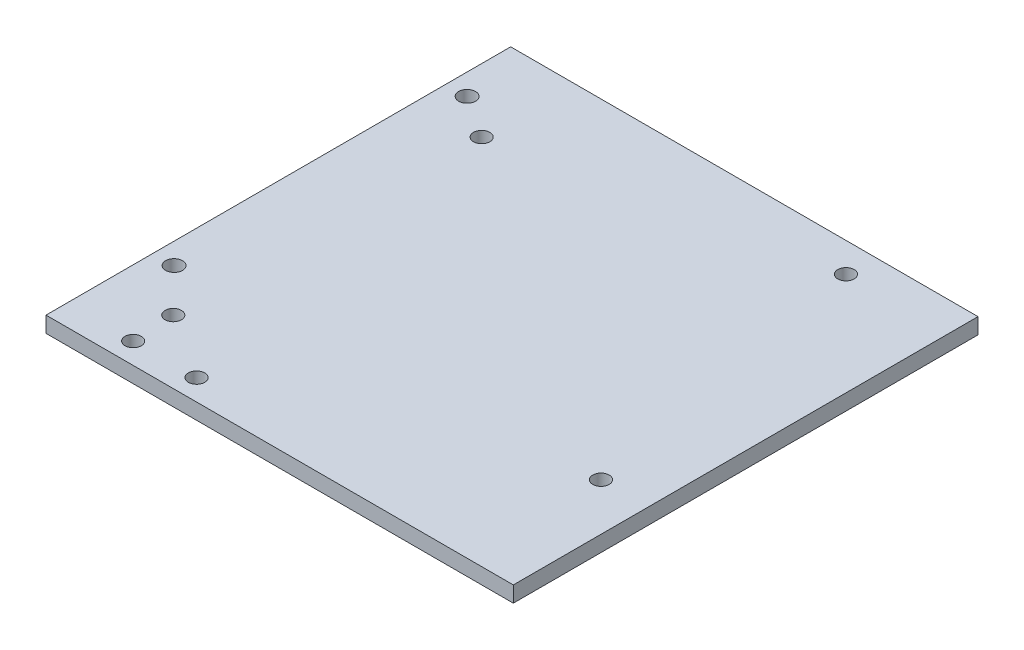
ISO-10303-21;
HEADER;
FILE_DESCRIPTION(('STEP AP214'),'2;1');
FILE_NAME('part.step','',(''),(''),'','','');
FILE_SCHEMA(('AUTOMOTIVE_DESIGN { 1 0 10303 214 1 1 1 1 }'));
ENDSEC;
DATA;
#1=APPLICATION_CONTEXT('core data for automotive mechanical design processes');
#2=APPLICATION_PROTOCOL_DEFINITION('international standard','automotive_design',2000,#1);
#3=PRODUCT_CONTEXT('',#1,'mechanical');
#4=PRODUCT('Part','Part','',(#3));
#5=PRODUCT_RELATED_PRODUCT_CATEGORY('part','',(#4));
#6=PRODUCT_DEFINITION_FORMATION('','',#4);
#7=PRODUCT_DEFINITION_CONTEXT('part definition',#1,'design');
#8=PRODUCT_DEFINITION('design','',#6,#7);
#9=PRODUCT_DEFINITION_SHAPE('','',#8);
#10=(LENGTH_UNIT() NAMED_UNIT(*) SI_UNIT(.MILLI.,.METRE.));
#11=(NAMED_UNIT(*) PLANE_ANGLE_UNIT() SI_UNIT($,.RADIAN.));
#12=(NAMED_UNIT(*) SI_UNIT($,.STERADIAN.) SOLID_ANGLE_UNIT());
#13=UNCERTAINTY_MEASURE_WITH_UNIT(LENGTH_MEASURE(1.E-05),#10,'distance_accuracy_value','');
#14=(GEOMETRIC_REPRESENTATION_CONTEXT(3) GLOBAL_UNCERTAINTY_ASSIGNED_CONTEXT((#13)) GLOBAL_UNIT_ASSIGNED_CONTEXT((#10,
#11,#12)) REPRESENTATION_CONTEXT('',''));
#15=CARTESIAN_POINT('',(0.,0.,0.));
#16=DIRECTION('',(0.,0.,1.));
#17=DIRECTION('',(1.,0.,0.));
#18=AXIS2_PLACEMENT_3D('',#15,#16,#17);
#19=CARTESIAN_POINT('',(0.,3.,0.));
#20=DIRECTION('',(0.,-1.,0.));
#21=DIRECTION('',(0.,0.,-1.));
#22=AXIS2_PLACEMENT_3D('',#19,#20,#21);
#23=PLANE('',#22);
#24=DIRECTION('',(0.,0.,-1.));
#25=VECTOR('',#24,1.);
#26=CARTESIAN_POINT('',(40.25,3.,40.));
#27=LINE('',#26,#25);
#28=CARTESIAN_POINT('',(40.25,3.,48.));
#29=VERTEX_POINT('',#28);
#30=CARTESIAN_POINT('',(40.25,3.,-40.));
#31=VERTEX_POINT('',#30);
#32=EDGE_CURVE('E57',#29,#31,#27,.T.);
#33=ORIENTED_EDGE('',*,*,#32,.T.);
#34=DIRECTION('',(-1.,0.,0.));
#35=VECTOR('',#34,1.);
#36=CARTESIAN_POINT('',(-40.25,3.,-40.));
#37=LINE('',#36,#35);
#38=CARTESIAN_POINT('',(-48.25,3.,-40.));
#39=VERTEX_POINT('',#38);
#40=EDGE_CURVE('E87',#31,#39,#37,.T.);
#41=ORIENTED_EDGE('',*,*,#40,.T.);
#42=DIRECTION('',(0.,0.,1.));
#43=VECTOR('',#42,1.);
#44=CARTESIAN_POINT('',(-48.25,3.,-40.));
#45=LINE('',#44,#43);
#46=CARTESIAN_POINT('',(-48.25,3.,48.));
#47=VERTEX_POINT('',#46);
#48=EDGE_CURVE('E91',#39,#47,#45,.T.);
#49=ORIENTED_EDGE('',*,*,#48,.T.);
#50=DIRECTION('',(1.,0.,0.));
#51=VECTOR('',#50,1.);
#52=CARTESIAN_POINT('',(-48.25,3.,48.));
#53=LINE('',#52,#51);
#54=EDGE_CURVE('E101',#47,#29,#53,.T.);
#55=ORIENTED_EDGE('',*,*,#54,.T.);
#56=EDGE_LOOP('',(#33,#41,#49,#55));
#57=FACE_BOUND('',#56,.T.);
#58=CARTESIAN_POINT('',(-36.2,3.,35.95));
#59=DIRECTION('',(0.,1.,0.));
#60=DIRECTION('',(0.,0.,1.));
#61=AXIS2_PLACEMENT_3D('',#58,#59,#60);
#62=CIRCLE('',#61,1.55);
#63=CARTESIAN_POINT('',(-36.2,3.,37.5));
#64=VERTEX_POINT('',#63);
#65=EDGE_CURVE('E110',#64,#64,#62,.T.);
#66=ORIENTED_EDGE('',*,*,#65,.F.);
#67=EDGE_LOOP('',(#66));
#68=FACE_BOUND('',#67,.T.);
#69=CARTESIAN_POINT('',(-36.2,3.,-22.45));
#70=DIRECTION('',(0.,1.,0.));
#71=DIRECTION('',(0.,0.,1.));
#72=AXIS2_PLACEMENT_3D('',#69,#70,#71);
#73=CIRCLE('',#72,1.55);
#74=CARTESIAN_POINT('',(-36.2,3.,-20.9));
#75=VERTEX_POINT('',#74);
#76=EDGE_CURVE('E229',#75,#75,#73,.T.);
#77=ORIENTED_EDGE('',*,*,#76,.F.);
#78=EDGE_LOOP('',(#77));
#79=FACE_BOUND('',#78,.T.);
#80=CARTESIAN_POINT('',(20.8,3.,-34.45));
#81=DIRECTION('',(0.,1.,0.));
#82=DIRECTION('',(0.,0.,1.));
#83=AXIS2_PLACEMENT_3D('',#80,#81,#82);
#84=CIRCLE('',#83,1.55);
#85=CARTESIAN_POINT('',(20.8,3.,-32.9));
#86=VERTEX_POINT('',#85);
#87=EDGE_CURVE('E221',#86,#86,#84,.T.);
#88=ORIENTED_EDGE('',*,*,#87,.F.);
#89=EDGE_LOOP('',(#88));
#90=FACE_BOUND('',#89,.T.);
#91=CARTESIAN_POINT('',(31.3,3.,22.45));
#92=DIRECTION('',(0.,1.,0.));
#93=DIRECTION('',(0.,0.,1.));
#94=AXIS2_PLACEMENT_3D('',#91,#92,#93);
#95=CIRCLE('',#94,1.55);
#96=CARTESIAN_POINT('',(31.3,3.,24.));
#97=VERTEX_POINT('',#96);
#98=EDGE_CURVE('E213',#97,#97,#95,.T.);
#99=ORIENTED_EDGE('',*,*,#98,.F.);
#100=EDGE_LOOP('',(#99));
#101=FACE_BOUND('',#100,.T.);
#102=CARTESIAN_POINT('',(-44.25,3.,-27.75));
#103=DIRECTION('',(0.,1.,0.));
#104=DIRECTION('',(0.,0.,1.));
#105=AXIS2_PLACEMENT_3D('',#102,#103,#104);
#106=CIRCLE('',#105,1.6);
#107=CARTESIAN_POINT('',(-44.25,3.,-26.15));
#108=VERTEX_POINT('',#107);
#109=EDGE_CURVE('E205',#108,#108,#106,.T.);
#110=ORIENTED_EDGE('',*,*,#109,.F.);
#111=EDGE_LOOP('',(#110));
#112=FACE_BOUND('',#111,.T.);
#113=CARTESIAN_POINT('',(-44.25,3.,27.75));
#114=DIRECTION('',(0.,1.,0.));
#115=DIRECTION('',(0.,0.,1.));
#116=AXIS2_PLACEMENT_3D('',#113,#114,#115);
#117=CIRCLE('',#116,1.6);
#118=CARTESIAN_POINT('',(-44.25,3.,29.35));
#119=VERTEX_POINT('',#118);
#120=EDGE_CURVE('E197',#119,#119,#117,.T.);
#121=ORIENTED_EDGE('',*,*,#120,.F.);
#122=EDGE_LOOP('',(#121));
#123=FACE_BOUND('',#122,.T.);
#124=CARTESIAN_POINT('',(-35.74,3.,44.));
#125=DIRECTION('',(0.,1.,0.));
#126=DIRECTION('',(0.,0.,1.));
#127=AXIS2_PLACEMENT_3D('',#124,#125,#126);
#128=CIRCLE('',#127,1.55);
#129=CARTESIAN_POINT('',(-35.74,3.,45.55));
#130=VERTEX_POINT('',#129);
#131=EDGE_CURVE('E189',#130,#130,#128,.T.);
#132=ORIENTED_EDGE('',*,*,#131,.F.);
#133=EDGE_LOOP('',(#132));
#134=FACE_BOUND('',#133,.T.);
#135=CARTESIAN_POINT('',(-23.74,3.,44.));
#136=DIRECTION('',(0.,1.,0.));
#137=DIRECTION('',(0.,0.,1.));
#138=AXIS2_PLACEMENT_3D('',#135,#136,#137);
#139=CIRCLE('',#138,1.55);
#140=CARTESIAN_POINT('',(-23.74,3.,45.55));
#141=VERTEX_POINT('',#140);
#142=EDGE_CURVE('E178',#141,#141,#139,.T.);
#143=ORIENTED_EDGE('',*,*,#142,.F.);
#144=EDGE_LOOP('',(#143));
#145=FACE_BOUND('',#144,.T.);
#146=ADVANCED_FACE('F39',(#57,#68,#79,#90,#101,#112,#123,#134,#145),#23,.F.);
#147=CARTESIAN_POINT('',(0.,0.,0.));
#148=DIRECTION('',(0.,-1.,0.));
#149=DIRECTION('',(0.,0.,-1.));
#150=AXIS2_PLACEMENT_3D('',#147,#148,#149);
#151=PLANE('',#150);
#152=CARTESIAN_POINT('',(-35.74,0.,44.));
#153=DIRECTION('',(0.,1.,0.));
#154=DIRECTION('',(0.,0.,1.));
#155=AXIS2_PLACEMENT_3D('',#152,#153,#154);
#156=CIRCLE('',#155,1.55);
#157=CARTESIAN_POINT('',(-35.74,0.,45.55));
#158=VERTEX_POINT('',#157);
#159=EDGE_CURVE('E186',#158,#158,#156,.T.);
#160=ORIENTED_EDGE('',*,*,#159,.T.);
#161=EDGE_LOOP('',(#160));
#162=FACE_BOUND('',#161,.T.);
#163=CARTESIAN_POINT('',(-44.25,0.,-27.75));
#164=DIRECTION('',(0.,1.,0.));
#165=DIRECTION('',(0.,0.,1.));
#166=AXIS2_PLACEMENT_3D('',#163,#164,#165);
#167=CIRCLE('',#166,1.6);
#168=CARTESIAN_POINT('',(-44.25,0.,-26.15));
#169=VERTEX_POINT('',#168);
#170=EDGE_CURVE('E201',#169,#169,#167,.T.);
#171=ORIENTED_EDGE('',*,*,#170,.T.);
#172=EDGE_LOOP('',(#171));
#173=FACE_BOUND('',#172,.T.);
#174=CARTESIAN_POINT('',(20.8,0.,-34.45));
#175=DIRECTION('',(0.,1.,0.));
#176=DIRECTION('',(0.,0.,1.));
#177=AXIS2_PLACEMENT_3D('',#174,#175,#176);
#178=CIRCLE('',#177,1.55);
#179=CARTESIAN_POINT('',(20.8,0.,-32.9));
#180=VERTEX_POINT('',#179);
#181=EDGE_CURVE('E217',#180,#180,#178,.T.);
#182=ORIENTED_EDGE('',*,*,#181,.T.);
#183=EDGE_LOOP('',(#182));
#184=FACE_BOUND('',#183,.T.);
#185=CARTESIAN_POINT('',(-36.2,0.,35.95));
#186=DIRECTION('',(0.,1.,0.));
#187=DIRECTION('',(0.,0.,1.));
#188=AXIS2_PLACEMENT_3D('',#185,#186,#187);
#189=CIRCLE('',#188,1.55);
#190=CARTESIAN_POINT('',(-36.2,0.,37.5));
#191=VERTEX_POINT('',#190);
#192=EDGE_CURVE('E233',#191,#191,#189,.T.);
#193=ORIENTED_EDGE('',*,*,#192,.T.);
#194=EDGE_LOOP('',(#193));
#195=FACE_BOUND('',#194,.T.);
#196=DIRECTION('',(-1.,0.,0.));
#197=VECTOR('',#196,1.);
#198=CARTESIAN_POINT('',(-40.25,0.,-40.));
#199=LINE('',#198,#197);
#200=CARTESIAN_POINT('',(40.25,0.,-40.));
#201=VERTEX_POINT('',#200);
#202=CARTESIAN_POINT('',(-48.25,0.,-40.));
#203=VERTEX_POINT('',#202);
#204=EDGE_CURVE('E95',#201,#203,#199,.T.);
#205=ORIENTED_EDGE('',*,*,#204,.F.);
#206=DIRECTION('',(0.,0.,-1.));
#207=VECTOR('',#206,1.);
#208=CARTESIAN_POINT('',(40.25,0.,48.));
#209=LINE('',#208,#207);
#210=CARTESIAN_POINT('',(40.25,0.,48.));
#211=VERTEX_POINT('',#210);
#212=EDGE_CURVE('E115',#211,#201,#209,.T.);
#213=ORIENTED_EDGE('',*,*,#212,.F.);
#214=DIRECTION('',(1.,0.,0.));
#215=VECTOR('',#214,1.);
#216=CARTESIAN_POINT('',(-48.25,0.,48.));
#217=LINE('',#216,#215);
#218=CARTESIAN_POINT('',(-48.25,0.,48.));
#219=VERTEX_POINT('',#218);
#220=EDGE_CURVE('E81',#219,#211,#217,.T.);
#221=ORIENTED_EDGE('',*,*,#220,.F.);
#222=DIRECTION('',(0.,0.,1.));
#223=VECTOR('',#222,1.);
#224=CARTESIAN_POINT('',(-48.25,0.,40.));
#225=LINE('',#224,#223);
#226=EDGE_CURVE('E74',#203,#219,#225,.T.);
#227=ORIENTED_EDGE('',*,*,#226,.F.);
#228=EDGE_LOOP('',(#205,#213,#221,#227));
#229=FACE_BOUND('',#228,.T.);
#230=CARTESIAN_POINT('',(-36.2,0.,-22.45));
#231=DIRECTION('',(0.,1.,0.));
#232=DIRECTION('',(0.,0.,1.));
#233=AXIS2_PLACEMENT_3D('',#230,#231,#232);
#234=CIRCLE('',#233,1.55);
#235=CARTESIAN_POINT('',(-36.2,0.,-20.9));
#236=VERTEX_POINT('',#235);
#237=EDGE_CURVE('E225',#236,#236,#234,.T.);
#238=ORIENTED_EDGE('',*,*,#237,.T.);
#239=EDGE_LOOP('',(#238));
#240=FACE_BOUND('',#239,.T.);
#241=CARTESIAN_POINT('',(31.3,0.,22.45));
#242=DIRECTION('',(0.,1.,0.));
#243=DIRECTION('',(0.,0.,1.));
#244=AXIS2_PLACEMENT_3D('',#241,#242,#243);
#245=CIRCLE('',#244,1.55);
#246=CARTESIAN_POINT('',(31.3,0.,24.));
#247=VERTEX_POINT('',#246);
#248=EDGE_CURVE('E209',#247,#247,#245,.T.);
#249=ORIENTED_EDGE('',*,*,#248,.T.);
#250=EDGE_LOOP('',(#249));
#251=FACE_BOUND('',#250,.T.);
#252=CARTESIAN_POINT('',(-44.25,0.,27.75));
#253=DIRECTION('',(0.,1.,0.));
#254=DIRECTION('',(0.,0.,1.));
#255=AXIS2_PLACEMENT_3D('',#252,#253,#254);
#256=CIRCLE('',#255,1.6);
#257=CARTESIAN_POINT('',(-44.25,0.,29.35));
#258=VERTEX_POINT('',#257);
#259=EDGE_CURVE('E193',#258,#258,#256,.T.);
#260=ORIENTED_EDGE('',*,*,#259,.T.);
#261=EDGE_LOOP('',(#260));
#262=FACE_BOUND('',#261,.T.);
#263=CARTESIAN_POINT('',(-23.74,0.,44.));
#264=DIRECTION('',(0.,1.,0.));
#265=DIRECTION('',(0.,0.,1.));
#266=AXIS2_PLACEMENT_3D('',#263,#264,#265);
#267=CIRCLE('',#266,1.55);
#268=CARTESIAN_POINT('',(-23.74,0.,45.55));
#269=VERTEX_POINT('',#268);
#270=EDGE_CURVE('E181',#269,#269,#267,.T.);
#271=ORIENTED_EDGE('',*,*,#270,.T.);
#272=EDGE_LOOP('',(#271));
#273=FACE_BOUND('',#272,.T.);
#274=ADVANCED_FACE('F125',(#162,#173,#184,#195,#229,#240,#251,#262,#273),#151,.T.);
#275=CARTESIAN_POINT('',(-40.25,3.,-40.));
#276=DIRECTION('',(0.,0.,1.));
#277=DIRECTION('',(1.,0.,0.));
#278=AXIS2_PLACEMENT_3D('',#275,#276,#277);
#279=PLANE('',#278);
#280=ORIENTED_EDGE('',*,*,#204,.T.);
#281=DIRECTION('',(0.,-1.,0.));
#282=VECTOR('',#281,1.);
#283=CARTESIAN_POINT('',(-48.25,3.,-40.));
#284=LINE('',#283,#282);
#285=EDGE_CURVE('E49',#39,#203,#284,.T.);
#286=ORIENTED_EDGE('',*,*,#285,.F.);
#287=ORIENTED_EDGE('',*,*,#40,.F.);
#288=DIRECTION('',(0.,-1.,0.));
#289=VECTOR('',#288,1.);
#290=CARTESIAN_POINT('',(40.25,3.,-40.));
#291=LINE('',#290,#289);
#292=EDGE_CURVE('E11',#31,#201,#291,.T.);
#293=ORIENTED_EDGE('',*,*,#292,.T.);
#294=EDGE_LOOP('',(#280,#286,#287,#293));
#295=FACE_BOUND('',#294,.T.);
#296=ADVANCED_FACE('F41',(#295),#279,.F.);
#297=CARTESIAN_POINT('',(-48.25,3.,40.));
#298=DIRECTION('',(1.,0.,0.));
#299=DIRECTION('',(0.,0.,-1.));
#300=AXIS2_PLACEMENT_3D('',#297,#298,#299);
#301=PLANE('',#300);
#302=ORIENTED_EDGE('',*,*,#226,.T.);
#303=DIRECTION('',(0.,-1.,0.));
#304=VECTOR('',#303,1.);
#305=CARTESIAN_POINT('',(-48.25,3.,48.));
#306=LINE('',#305,#304);
#307=EDGE_CURVE('E97',#47,#219,#306,.T.);
#308=ORIENTED_EDGE('',*,*,#307,.F.);
#309=ORIENTED_EDGE('',*,*,#48,.F.);
#310=ORIENTED_EDGE('',*,*,#285,.T.);
#311=EDGE_LOOP('',(#302,#308,#309,#310));
#312=FACE_BOUND('',#311,.T.);
#313=ADVANCED_FACE('F98',(#312),#301,.F.);
#314=CARTESIAN_POINT('',(-48.25,3.,48.));
#315=DIRECTION('',(0.,0.,-1.));
#316=DIRECTION('',(-1.,0.,0.));
#317=AXIS2_PLACEMENT_3D('',#314,#315,#316);
#318=PLANE('',#317);
#319=ORIENTED_EDGE('',*,*,#220,.T.);
#320=DIRECTION('',(0.,-1.,0.));
#321=VECTOR('',#320,1.);
#322=CARTESIAN_POINT('',(40.25,3.,48.));
#323=LINE('',#322,#321);
#324=EDGE_CURVE('E104',#29,#211,#323,.T.);
#325=ORIENTED_EDGE('',*,*,#324,.F.);
#326=ORIENTED_EDGE('',*,*,#54,.F.);
#327=ORIENTED_EDGE('',*,*,#307,.T.);
#328=EDGE_LOOP('',(#319,#325,#326,#327));
#329=FACE_BOUND('',#328,.T.);
#330=ADVANCED_FACE('F122',(#329),#318,.F.);
#331=CARTESIAN_POINT('',(40.25,3.,48.));
#332=DIRECTION('',(-1.,0.,0.));
#333=DIRECTION('',(0.,0.,1.));
#334=AXIS2_PLACEMENT_3D('',#331,#332,#333);
#335=PLANE('',#334);
#336=ORIENTED_EDGE('',*,*,#212,.T.);
#337=ORIENTED_EDGE('',*,*,#292,.F.);
#338=ORIENTED_EDGE('',*,*,#32,.F.);
#339=ORIENTED_EDGE('',*,*,#324,.T.);
#340=EDGE_LOOP('',(#336,#337,#338,#339));
#341=FACE_BOUND('',#340,.T.);
#342=ADVANCED_FACE('F127',(#341),#335,.F.);
#343=CARTESIAN_POINT('',(-36.2,3.,35.95));
#344=DIRECTION('',(0.,-1.,0.));
#345=DIRECTION('',(0.,0.,-1.));
#346=AXIS2_PLACEMENT_3D('',#343,#344,#345);
#347=CYLINDRICAL_SURFACE('',#346,1.55);
#348=ORIENTED_EDGE('',*,*,#65,.T.);
#349=EDGE_LOOP('',(#348));
#350=FACE_BOUND('',#349,.T.);
#351=ORIENTED_EDGE('',*,*,#192,.F.);
#352=EDGE_LOOP('',(#351));
#353=FACE_BOUND('',#352,.T.);
#354=ADVANCED_FACE('F129',(#350,#353),#347,.F.);
#355=CARTESIAN_POINT('',(-36.2,3.,-22.45));
#356=DIRECTION('',(0.,-1.,0.));
#357=DIRECTION('',(0.,0.,-1.));
#358=AXIS2_PLACEMENT_3D('',#355,#356,#357);
#359=CYLINDRICAL_SURFACE('',#358,1.55);
#360=ORIENTED_EDGE('',*,*,#76,.T.);
#361=EDGE_LOOP('',(#360));
#362=FACE_BOUND('',#361,.T.);
#363=ORIENTED_EDGE('',*,*,#237,.F.);
#364=EDGE_LOOP('',(#363));
#365=FACE_BOUND('',#364,.T.);
#366=ADVANCED_FACE('F135',(#362,#365),#359,.F.);
#367=CARTESIAN_POINT('',(20.8,3.,-34.45));
#368=DIRECTION('',(0.,-1.,0.));
#369=DIRECTION('',(0.,0.,-1.));
#370=AXIS2_PLACEMENT_3D('',#367,#368,#369);
#371=CYLINDRICAL_SURFACE('',#370,1.55);
#372=ORIENTED_EDGE('',*,*,#87,.T.);
#373=EDGE_LOOP('',(#372));
#374=FACE_BOUND('',#373,.T.);
#375=ORIENTED_EDGE('',*,*,#181,.F.);
#376=EDGE_LOOP('',(#375));
#377=FACE_BOUND('',#376,.T.);
#378=ADVANCED_FACE('F149',(#374,#377),#371,.F.);
#379=CARTESIAN_POINT('',(31.3,3.,22.45));
#380=DIRECTION('',(0.,-1.,0.));
#381=DIRECTION('',(0.,0.,-1.));
#382=AXIS2_PLACEMENT_3D('',#379,#380,#381);
#383=CYLINDRICAL_SURFACE('',#382,1.55);
#384=ORIENTED_EDGE('',*,*,#98,.T.);
#385=EDGE_LOOP('',(#384));
#386=FACE_BOUND('',#385,.T.);
#387=ORIENTED_EDGE('',*,*,#248,.F.);
#388=EDGE_LOOP('',(#387));
#389=FACE_BOUND('',#388,.T.);
#390=ADVANCED_FACE('F153',(#386,#389),#383,.F.);
#391=CARTESIAN_POINT('',(-44.25,3.,-27.75));
#392=DIRECTION('',(0.,-1.,0.));
#393=DIRECTION('',(0.,0.,-1.));
#394=AXIS2_PLACEMENT_3D('',#391,#392,#393);
#395=CYLINDRICAL_SURFACE('',#394,1.6);
#396=ORIENTED_EDGE('',*,*,#109,.T.);
#397=EDGE_LOOP('',(#396));
#398=FACE_BOUND('',#397,.T.);
#399=ORIENTED_EDGE('',*,*,#170,.F.);
#400=EDGE_LOOP('',(#399));
#401=FACE_BOUND('',#400,.T.);
#402=ADVANCED_FACE('F157',(#398,#401),#395,.F.);
#403=CARTESIAN_POINT('',(-44.25,3.,27.75));
#404=DIRECTION('',(0.,-1.,0.));
#405=DIRECTION('',(0.,0.,-1.));
#406=AXIS2_PLACEMENT_3D('',#403,#404,#405);
#407=CYLINDRICAL_SURFACE('',#406,1.6);
#408=ORIENTED_EDGE('',*,*,#120,.T.);
#409=EDGE_LOOP('',(#408));
#410=FACE_BOUND('',#409,.T.);
#411=ORIENTED_EDGE('',*,*,#259,.F.);
#412=EDGE_LOOP('',(#411));
#413=FACE_BOUND('',#412,.T.);
#414=ADVANCED_FACE('F161',(#410,#413),#407,.F.);
#415=CARTESIAN_POINT('',(-35.74,3.,44.));
#416=DIRECTION('',(0.,-1.,0.));
#417=DIRECTION('',(0.,0.,-1.));
#418=AXIS2_PLACEMENT_3D('',#415,#416,#417);
#419=CYLINDRICAL_SURFACE('',#418,1.55);
#420=ORIENTED_EDGE('',*,*,#131,.T.);
#421=EDGE_LOOP('',(#420));
#422=FACE_BOUND('',#421,.T.);
#423=ORIENTED_EDGE('',*,*,#159,.F.);
#424=EDGE_LOOP('',(#423));
#425=FACE_BOUND('',#424,.T.);
#426=ADVANCED_FACE('F165',(#422,#425),#419,.F.);
#427=CARTESIAN_POINT('',(-23.74,3.,44.));
#428=DIRECTION('',(0.,-1.,0.));
#429=DIRECTION('',(0.,0.,-1.));
#430=AXIS2_PLACEMENT_3D('',#427,#428,#429);
#431=CYLINDRICAL_SURFACE('',#430,1.55);
#432=ORIENTED_EDGE('',*,*,#142,.T.);
#433=EDGE_LOOP('',(#432));
#434=FACE_BOUND('',#433,.T.);
#435=ORIENTED_EDGE('',*,*,#270,.F.);
#436=EDGE_LOOP('',(#435));
#437=FACE_BOUND('',#436,.T.);
#438=ADVANCED_FACE('F169',(#434,#437),#431,.F.);
#439=CLOSED_SHELL('',(#146,#274,#296,#313,#330,#342,#354,#366,#378,#390,#402,#414,#426,#438));
#440=MANIFOLD_SOLID_BREP('B2',#439);
#441=ADVANCED_BREP_SHAPE_REPRESENTATION('',(#18,#440),#14);
#442=SHAPE_DEFINITION_REPRESENTATION(#9,#441);
ENDSEC;
END-ISO-10303-21;
